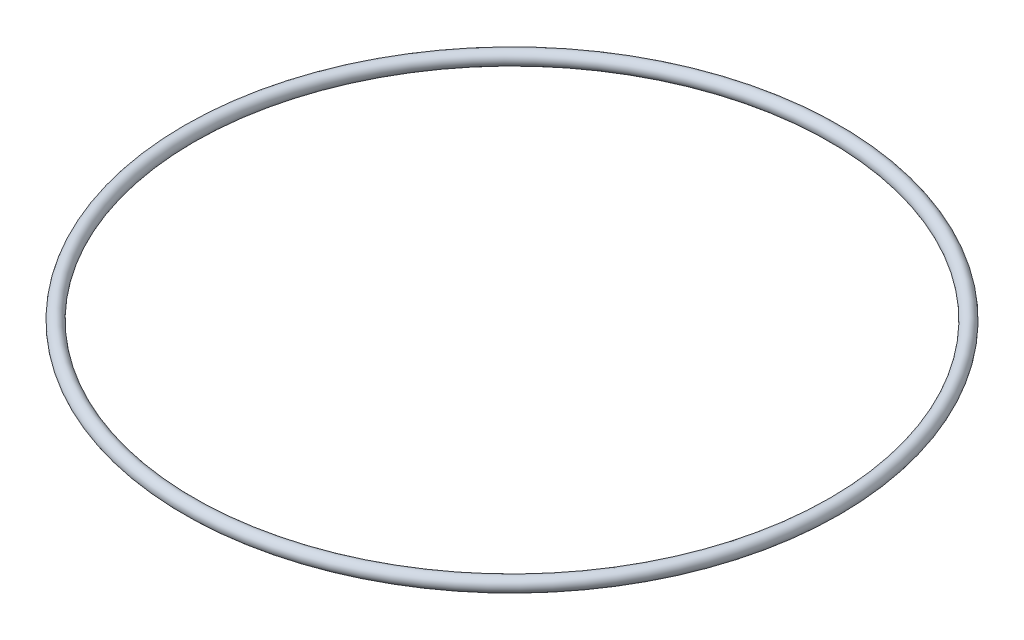
ISO-10303-21;
HEADER;
FILE_DESCRIPTION(('STEP AP214'),'2;1');
FILE_NAME('part.step','',(''),(''),'','','');
FILE_SCHEMA(('AUTOMOTIVE_DESIGN { 1 0 10303 214 1 1 1 1 }'));
ENDSEC;
DATA;
#1=APPLICATION_CONTEXT('core data for automotive mechanical design processes');
#2=APPLICATION_PROTOCOL_DEFINITION('international standard','automotive_design',2000,#1);
#3=PRODUCT_CONTEXT('',#1,'mechanical');
#4=PRODUCT('Part','Part','',(#3));
#5=PRODUCT_RELATED_PRODUCT_CATEGORY('part','',(#4));
#6=PRODUCT_DEFINITION_FORMATION('','',#4);
#7=PRODUCT_DEFINITION_CONTEXT('part definition',#1,'design');
#8=PRODUCT_DEFINITION('design','',#6,#7);
#9=PRODUCT_DEFINITION_SHAPE('','',#8);
#10=(LENGTH_UNIT() NAMED_UNIT(*) SI_UNIT(.MILLI.,.METRE.));
#11=(NAMED_UNIT(*) PLANE_ANGLE_UNIT() SI_UNIT($,.RADIAN.));
#12=(NAMED_UNIT(*) SI_UNIT($,.STERADIAN.) SOLID_ANGLE_UNIT());
#13=UNCERTAINTY_MEASURE_WITH_UNIT(LENGTH_MEASURE(1.E-05),#10,'distance_accuracy_value','');
#14=(GEOMETRIC_REPRESENTATION_CONTEXT(3) GLOBAL_UNCERTAINTY_ASSIGNED_CONTEXT((#13)) GLOBAL_UNIT_ASSIGNED_CONTEXT((#10,
#11,#12)) REPRESENTATION_CONTEXT('',''));
#15=CARTESIAN_POINT('',(0.,0.,0.));
#16=DIRECTION('',(0.,0.,1.));
#17=DIRECTION('',(1.,0.,0.));
#18=AXIS2_PLACEMENT_3D('',#15,#16,#17);
#19=CARTESIAN_POINT('',(0.,0.,0.));
#20=DIRECTION('',(0.,1.,0.));
#21=DIRECTION('',(0.,0.,1.));
#22=AXIS2_PLACEMENT_3D('',#19,#20,#21);
#23=TOROIDAL_SURFACE('',#22,71.35,1.5);
#24=CARTESIAN_POINT('',(71.35,0.,0.));
#25=DIRECTION('',(0.,0.,1.));
#26=DIRECTION('',(1.,0.,0.));
#27=AXIS2_PLACEMENT_3D('',#24,#25,#26);
#28=CIRCLE('',#27,1.5);
#29=CARTESIAN_POINT('',(72.85,0.,0.));
#30=VERTEX_POINT('',#29);
#31=EDGE_CURVE('E10',#30,#30,#28,.T.);
#32=CARTESIAN_POINT('',(0.,0.,0.));
#33=DIRECTION('',(0.,1.,0.));
#34=DIRECTION('',(0.,0.,1.));
#35=AXIS2_PLACEMENT_3D('',#32,#33,#34);
#36=CIRCLE('',#35,72.85);
#37=EDGE_CURVE('',#30,#30,#36,.T.);
#38=ORIENTED_EDGE('',*,*,#31,.F.);
#39=ORIENTED_EDGE('',*,*,#31,.T.);
#40=ORIENTED_EDGE('',*,*,#37,.T.);
#41=ORIENTED_EDGE('',*,*,#37,.F.);
#42=EDGE_LOOP('',(#38,#40,#39,#41));
#43=FACE_BOUND('',#42,.T.);
#44=ADVANCED_FACE('F37',(#43),#23,.T.);
#45=CLOSED_SHELL('',(#44));
#46=MANIFOLD_SOLID_BREP('B2',#45);
#47=ADVANCED_BREP_SHAPE_REPRESENTATION('',(#18,#46),#14);
#48=SHAPE_DEFINITION_REPRESENTATION(#9,#47);
ENDSEC;
END-ISO-10303-21;
